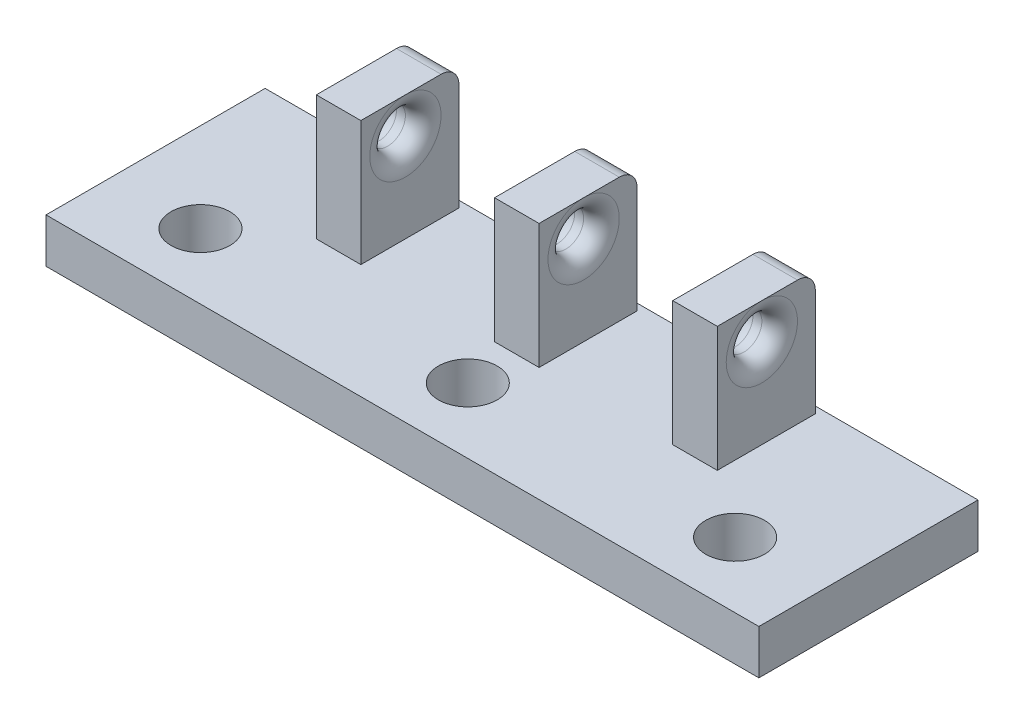
ISO-10303-21;
HEADER;
FILE_DESCRIPTION(('STEP AP214'),'2;1');
FILE_NAME('part.step','',(''),(''),'','','');
FILE_SCHEMA(('AUTOMOTIVE_DESIGN { 1 0 10303 214 1 1 1 1 }'));
ENDSEC;
DATA;
#1=APPLICATION_CONTEXT('core data for automotive mechanical design processes');
#2=APPLICATION_PROTOCOL_DEFINITION('international standard','automotive_design',2000,#1);
#3=PRODUCT_CONTEXT('',#1,'mechanical');
#4=PRODUCT('Part','Part','',(#3));
#5=PRODUCT_RELATED_PRODUCT_CATEGORY('part','',(#4));
#6=PRODUCT_DEFINITION_FORMATION('','',#4);
#7=PRODUCT_DEFINITION_CONTEXT('part definition',#1,'design');
#8=PRODUCT_DEFINITION('design','',#6,#7);
#9=PRODUCT_DEFINITION_SHAPE('','',#8);
#10=(LENGTH_UNIT() NAMED_UNIT(*) SI_UNIT(.MILLI.,.METRE.));
#11=(NAMED_UNIT(*) PLANE_ANGLE_UNIT() SI_UNIT($,.RADIAN.));
#12=(NAMED_UNIT(*) SI_UNIT($,.STERADIAN.) SOLID_ANGLE_UNIT());
#13=UNCERTAINTY_MEASURE_WITH_UNIT(LENGTH_MEASURE(1.E-05),#10,'distance_accuracy_value','');
#14=(GEOMETRIC_REPRESENTATION_CONTEXT(3) GLOBAL_UNCERTAINTY_ASSIGNED_CONTEXT((#13)) GLOBAL_UNIT_ASSIGNED_CONTEXT((#10,
#11,#12)) REPRESENTATION_CONTEXT('',''));
#15=CARTESIAN_POINT('',(0.,0.,0.));
#16=DIRECTION('',(0.,0.,1.));
#17=DIRECTION('',(1.,0.,0.));
#18=AXIS2_PLACEMENT_3D('',#15,#16,#17);
#19=CARTESIAN_POINT('',(0.,2.5,0.));
#20=DIRECTION('',(0.,1.,0.));
#21=DIRECTION('',(0.,0.,1.));
#22=AXIS2_PLACEMENT_3D('',#19,#20,#21);
#23=PLANE('',#22);
#24=DIRECTION('',(1.,0.,0.));
#25=VECTOR('',#24,1.);
#26=CARTESIAN_POINT('',(-20.,2.5,2.37214905674166));
#27=LINE('',#26,#25);
#28=CARTESIAN_POINT('',(-20.,2.5,2.37214905674166));
#29=VERTEX_POINT('',#28);
#30=CARTESIAN_POINT('',(20.,2.5,2.37214905674166));
#31=VERTEX_POINT('',#30);
#32=EDGE_CURVE('E59',#29,#31,#27,.T.);
#33=ORIENTED_EDGE('',*,*,#32,.F.);
#34=DIRECTION('',(0.,0.,1.));
#35=VECTOR('',#34,1.);
#36=CARTESIAN_POINT('',(-20.,2.5,14.6666666666667));
#37=LINE('',#36,#35);
#38=CARTESIAN_POINT('',(-20.,2.5,14.6666666666667));
#39=VERTEX_POINT('',#38);
#40=EDGE_CURVE('E208',#29,#39,#37,.T.);
#41=ORIENTED_EDGE('',*,*,#40,.T.);
#42=DIRECTION('',(1.,0.,0.));
#43=VECTOR('',#42,1.);
#44=CARTESIAN_POINT('',(20.,2.5,14.6666666666667));
#45=LINE('',#44,#43);
#46=CARTESIAN_POINT('',(20.,2.5,14.6666666666667));
#47=VERTEX_POINT('',#46);
#48=EDGE_CURVE('E322',#39,#47,#45,.T.);
#49=ORIENTED_EDGE('',*,*,#48,.T.);
#50=DIRECTION('',(0.,0.,-1.));
#51=VECTOR('',#50,1.);
#52=CARTESIAN_POINT('',(20.,2.5,14.6666666666667));
#53=LINE('',#52,#51);
#54=EDGE_CURVE('E226',#47,#31,#53,.T.);
#55=ORIENTED_EDGE('',*,*,#54,.T.);
#56=EDGE_LOOP('',(#33,#41,#49,#55));
#57=FACE_BOUND('',#56,.T.);
#58=CARTESIAN_POINT('',(1.14491749414469E-13,2.5,11.));
#59=DIRECTION('',(0.,1.,0.));
#60=DIRECTION('',(0.,0.,1.));
#61=AXIS2_PLACEMENT_3D('',#58,#59,#60);
#62=CIRCLE('',#61,1.65);
#63=CARTESIAN_POINT('',(1.14491749414469E-13,2.5,12.65));
#64=VERTEX_POINT('',#63);
#65=EDGE_CURVE('E216',#64,#64,#62,.T.);
#66=ORIENTED_EDGE('',*,*,#65,.F.);
#67=EDGE_LOOP('',(#66));
#68=FACE_BOUND('',#67,.T.);
#69=CARTESIAN_POINT('',(15.0000000000001,2.5,11.));
#70=DIRECTION('',(0.,1.,0.));
#71=DIRECTION('',(0.,0.,1.));
#72=AXIS2_PLACEMENT_3D('',#69,#70,#71);
#73=CIRCLE('',#72,1.65);
#74=CARTESIAN_POINT('',(15.0000000000001,2.5,12.65));
#75=VERTEX_POINT('',#74);
#76=EDGE_CURVE('E330',#75,#75,#73,.T.);
#77=ORIENTED_EDGE('',*,*,#76,.F.);
#78=EDGE_LOOP('',(#77));
#79=FACE_BOUND('',#78,.T.);
#80=CARTESIAN_POINT('',(-14.9999999999999,2.5,11.));
#81=DIRECTION('',(0.,1.,0.));
#82=DIRECTION('',(0.,0.,1.));
#83=AXIS2_PLACEMENT_3D('',#80,#81,#82);
#84=CIRCLE('',#83,1.65);
#85=CARTESIAN_POINT('',(-14.9999999999999,2.5,12.65));
#86=VERTEX_POINT('',#85);
#87=EDGE_CURVE('E336',#86,#86,#84,.T.);
#88=ORIENTED_EDGE('',*,*,#87,.F.);
#89=EDGE_LOOP('',(#88));
#90=FACE_BOUND('',#89,.T.);
#91=DIRECTION('',(-1.,0.,0.));
#92=VECTOR('',#91,1.);
#93=CARTESIAN_POINT('',(-1.25,2.5,2.75));
#94=LINE('',#93,#92);
#95=CARTESIAN_POINT('',(1.25,2.5,2.75));
#96=VERTEX_POINT('',#95);
#97=CARTESIAN_POINT('',(-1.25,2.5,2.75));
#98=VERTEX_POINT('',#97);
#99=EDGE_CURVE('E369',#96,#98,#94,.T.);
#100=ORIENTED_EDGE('',*,*,#99,.F.);
#101=DIRECTION('',(0.,0.,-1.));
#102=VECTOR('',#101,1.);
#103=CARTESIAN_POINT('',(1.25,2.5,8.25));
#104=LINE('',#103,#102);
#105=CARTESIAN_POINT('',(1.25,2.5,8.25));
#106=VERTEX_POINT('',#105);
#107=EDGE_CURVE('E373',#106,#96,#104,.T.);
#108=ORIENTED_EDGE('',*,*,#107,.F.);
#109=DIRECTION('',(1.,0.,0.));
#110=VECTOR('',#109,1.);
#111=CARTESIAN_POINT('',(-1.25,2.5,8.25));
#112=LINE('',#111,#110);
#113=CARTESIAN_POINT('',(-1.25,2.5,8.25));
#114=VERTEX_POINT('',#113);
#115=EDGE_CURVE('E361',#114,#106,#112,.T.);
#116=ORIENTED_EDGE('',*,*,#115,.F.);
#117=DIRECTION('',(0.,0.,1.));
#118=VECTOR('',#117,1.);
#119=CARTESIAN_POINT('',(-1.25,2.5,8.25));
#120=LINE('',#119,#118);
#121=EDGE_CURVE('E365',#98,#114,#120,.T.);
#122=ORIENTED_EDGE('',*,*,#121,.F.);
#123=EDGE_LOOP('',(#100,#108,#116,#122));
#124=FACE_BOUND('',#123,.T.);
#125=DIRECTION('',(-1.,0.,0.));
#126=VECTOR('',#125,1.);
#127=CARTESIAN_POINT('',(8.75,2.5,2.75));
#128=LINE('',#127,#126);
#129=CARTESIAN_POINT('',(11.25,2.5,2.75));
#130=VERTEX_POINT('',#129);
#131=CARTESIAN_POINT('',(8.75,2.5,2.75));
#132=VERTEX_POINT('',#131);
#133=EDGE_CURVE('E405',#130,#132,#128,.T.);
#134=ORIENTED_EDGE('',*,*,#133,.F.);
#135=DIRECTION('',(0.,0.,-1.));
#136=VECTOR('',#135,1.);
#137=CARTESIAN_POINT('',(11.25,2.5,8.25));
#138=LINE('',#137,#136);
#139=CARTESIAN_POINT('',(11.25,2.5,8.25));
#140=VERTEX_POINT('',#139);
#141=EDGE_CURVE('E377',#140,#130,#138,.T.);
#142=ORIENTED_EDGE('',*,*,#141,.F.);
#143=DIRECTION('',(1.,0.,0.));
#144=VECTOR('',#143,1.);
#145=CARTESIAN_POINT('',(8.75,2.5,8.25));
#146=LINE('',#145,#144);
#147=CARTESIAN_POINT('',(8.75,2.5,8.25));
#148=VERTEX_POINT('',#147);
#149=EDGE_CURVE('E392',#148,#140,#146,.T.);
#150=ORIENTED_EDGE('',*,*,#149,.F.);
#151=DIRECTION('',(0.,0.,1.));
#152=VECTOR('',#151,1.);
#153=CARTESIAN_POINT('',(8.75,2.5,8.25));
#154=LINE('',#153,#152);
#155=EDGE_CURVE('E409',#132,#148,#154,.T.);
#156=ORIENTED_EDGE('',*,*,#155,.F.);
#157=EDGE_LOOP('',(#134,#142,#150,#156));
#158=FACE_BOUND('',#157,.T.);
#159=DIRECTION('',(-1.,0.,0.));
#160=VECTOR('',#159,1.);
#161=CARTESIAN_POINT('',(-8.75,2.5,2.75));
#162=LINE('',#161,#160);
#163=CARTESIAN_POINT('',(-8.75,2.5,2.75));
#164=VERTEX_POINT('',#163);
#165=CARTESIAN_POINT('',(-11.25,2.5,2.75));
#166=VERTEX_POINT('',#165);
#167=EDGE_CURVE('E445',#164,#166,#162,.T.);
#168=ORIENTED_EDGE('',*,*,#167,.F.);
#169=DIRECTION('',(0.,0.,-1.));
#170=VECTOR('',#169,1.);
#171=CARTESIAN_POINT('',(-8.75,2.5,8.25));
#172=LINE('',#171,#170);
#173=CARTESIAN_POINT('',(-8.75,2.5,8.25));
#174=VERTEX_POINT('',#173);
#175=EDGE_CURVE('E427',#174,#164,#172,.T.);
#176=ORIENTED_EDGE('',*,*,#175,.F.);
#177=DIRECTION('',(1.,0.,0.));
#178=VECTOR('',#177,1.);
#179=CARTESIAN_POINT('',(-8.75,2.5,8.25));
#180=LINE('',#179,#178);
#181=CARTESIAN_POINT('',(-11.25,2.5,8.25));
#182=VERTEX_POINT('',#181);
#183=EDGE_CURVE('E432',#182,#174,#180,.T.);
#184=ORIENTED_EDGE('',*,*,#183,.F.);
#185=DIRECTION('',(0.,0.,1.));
#186=VECTOR('',#185,1.);
#187=CARTESIAN_POINT('',(-11.25,2.5,8.25));
#188=LINE('',#187,#186);
#189=EDGE_CURVE('E449',#166,#182,#188,.T.);
#190=ORIENTED_EDGE('',*,*,#189,.F.);
#191=EDGE_LOOP('',(#168,#176,#184,#190));
#192=FACE_BOUND('',#191,.T.);
#193=ADVANCED_FACE('F43',(#57,#68,#79,#90,#124,#158,#192),#23,.T.);
#194=CARTESIAN_POINT('',(0.,0.,0.));
#195=DIRECTION('',(0.,1.,0.));
#196=DIRECTION('',(0.,0.,1.));
#197=AXIS2_PLACEMENT_3D('',#194,#195,#196);
#198=PLANE('',#197);
#199=DIRECTION('',(0.,0.,1.));
#200=VECTOR('',#199,1.);
#201=CARTESIAN_POINT('',(-20.,0.,14.6666666666667));
#202=LINE('',#201,#200);
#203=CARTESIAN_POINT('',(-20.,0.,2.37214905674166));
#204=VERTEX_POINT('',#203);
#205=CARTESIAN_POINT('',(-20.,0.,14.6666666666667));
#206=VERTEX_POINT('',#205);
#207=EDGE_CURVE('E206',#204,#206,#202,.T.);
#208=ORIENTED_EDGE('',*,*,#207,.F.);
#209=DIRECTION('',(-1.,0.,0.));
#210=VECTOR('',#209,1.);
#211=CARTESIAN_POINT('',(-20.,0.,2.37214905674166));
#212=LINE('',#211,#210);
#213=CARTESIAN_POINT('',(20.,0.,2.37214905674166));
#214=VERTEX_POINT('',#213);
#215=EDGE_CURVE('E190',#214,#204,#212,.T.);
#216=ORIENTED_EDGE('',*,*,#215,.F.);
#217=DIRECTION('',(0.,0.,-1.));
#218=VECTOR('',#217,1.);
#219=CARTESIAN_POINT('',(20.,0.,14.6666666666667));
#220=LINE('',#219,#218);
#221=CARTESIAN_POINT('',(20.,0.,14.6666666666667));
#222=VERTEX_POINT('',#221);
#223=EDGE_CURVE('E220',#222,#214,#220,.T.);
#224=ORIENTED_EDGE('',*,*,#223,.F.);
#225=DIRECTION('',(1.,0.,0.));
#226=VECTOR('',#225,1.);
#227=CARTESIAN_POINT('',(20.,0.,14.6666666666667));
#228=LINE('',#227,#226);
#229=EDGE_CURVE('E213',#206,#222,#228,.T.);
#230=ORIENTED_EDGE('',*,*,#229,.F.);
#231=EDGE_LOOP('',(#208,#216,#224,#230));
#232=FACE_BOUND('',#231,.T.);
#233=CARTESIAN_POINT('',(1.14491749414469E-13,0.,11.));
#234=DIRECTION('',(0.,1.,0.));
#235=DIRECTION('',(0.,0.,1.));
#236=AXIS2_PLACEMENT_3D('',#233,#234,#235);
#237=CIRCLE('',#236,1.65);
#238=CARTESIAN_POINT('',(1.14491749414469E-13,0.,12.65));
#239=VERTEX_POINT('',#238);
#240=EDGE_CURVE('E223',#239,#239,#237,.T.);
#241=ORIENTED_EDGE('',*,*,#240,.T.);
#242=EDGE_LOOP('',(#241));
#243=FACE_BOUND('',#242,.T.);
#244=CARTESIAN_POINT('',(15.0000000000001,0.,11.));
#245=DIRECTION('',(0.,1.,0.));
#246=DIRECTION('',(0.,0.,1.));
#247=AXIS2_PLACEMENT_3D('',#244,#245,#246);
#248=CIRCLE('',#247,1.65);
#249=CARTESIAN_POINT('',(15.0000000000001,0.,12.65));
#250=VERTEX_POINT('',#249);
#251=EDGE_CURVE('E332',#250,#250,#248,.T.);
#252=ORIENTED_EDGE('',*,*,#251,.T.);
#253=EDGE_LOOP('',(#252));
#254=FACE_BOUND('',#253,.T.);
#255=CARTESIAN_POINT('',(-14.9999999999999,0.,11.));
#256=DIRECTION('',(0.,1.,0.));
#257=DIRECTION('',(0.,0.,1.));
#258=AXIS2_PLACEMENT_3D('',#255,#256,#257);
#259=CIRCLE('',#258,1.65);
#260=CARTESIAN_POINT('',(-14.9999999999999,0.,12.65));
#261=VERTEX_POINT('',#260);
#262=EDGE_CURVE('E340',#261,#261,#259,.T.);
#263=ORIENTED_EDGE('',*,*,#262,.T.);
#264=EDGE_LOOP('',(#263));
#265=FACE_BOUND('',#264,.T.);
#266=ADVANCED_FACE('F211',(#232,#243,#254,#265),#198,.F.);
#267=CARTESIAN_POINT('',(-20.,2.5,14.6666666666667));
#268=DIRECTION('',(1.,0.,0.));
#269=DIRECTION('',(0.,0.,-1.));
#270=AXIS2_PLACEMENT_3D('',#267,#268,#269);
#271=PLANE('',#270);
#272=ORIENTED_EDGE('',*,*,#40,.F.);
#273=DIRECTION('',(0.,1.,0.));
#274=VECTOR('',#273,1.);
#275=CARTESIAN_POINT('',(-20.,-0.00100000000000013,2.37214905674166));
#276=LINE('',#275,#274);
#277=EDGE_CURVE('E193',#204,#29,#276,.T.);
#278=ORIENTED_EDGE('',*,*,#277,.F.);
#279=ORIENTED_EDGE('',*,*,#207,.T.);
#280=DIRECTION('',(0.,-1.,0.));
#281=VECTOR('',#280,1.);
#282=CARTESIAN_POINT('',(-20.,2.5,14.6666666666667));
#283=LINE('',#282,#281);
#284=EDGE_CURVE('E235',#39,#206,#283,.T.);
#285=ORIENTED_EDGE('',*,*,#284,.F.);
#286=EDGE_LOOP('',(#272,#278,#279,#285));
#287=FACE_BOUND('',#286,.T.);
#288=ADVANCED_FACE('F204',(#287),#271,.F.);
#289=CARTESIAN_POINT('',(20.,2.5,14.6666666666667));
#290=DIRECTION('',(0.,0.,-1.));
#291=DIRECTION('',(-1.,0.,0.));
#292=AXIS2_PLACEMENT_3D('',#289,#290,#291);
#293=PLANE('',#292);
#294=ORIENTED_EDGE('',*,*,#229,.T.);
#295=DIRECTION('',(0.,-1.,0.));
#296=VECTOR('',#295,1.);
#297=CARTESIAN_POINT('',(20.,2.5,14.6666666666667));
#298=LINE('',#297,#296);
#299=EDGE_CURVE('E231',#47,#222,#298,.T.);
#300=ORIENTED_EDGE('',*,*,#299,.F.);
#301=ORIENTED_EDGE('',*,*,#48,.F.);
#302=ORIENTED_EDGE('',*,*,#284,.T.);
#303=EDGE_LOOP('',(#294,#300,#301,#302));
#304=FACE_BOUND('',#303,.T.);
#305=ADVANCED_FACE('F663',(#304),#293,.F.);
#306=CARTESIAN_POINT('',(20.,2.5,14.6666666666667));
#307=DIRECTION('',(-1.,0.,0.));
#308=DIRECTION('',(0.,0.,1.));
#309=AXIS2_PLACEMENT_3D('',#306,#307,#308);
#310=PLANE('',#309);
#311=ORIENTED_EDGE('',*,*,#223,.T.);
#312=DIRECTION('',(0.,1.,0.));
#313=VECTOR('',#312,1.);
#314=CARTESIAN_POINT('',(20.,-0.00100000000000013,2.37214905674166));
#315=LINE('',#314,#313);
#316=EDGE_CURVE('E194',#214,#31,#315,.T.);
#317=ORIENTED_EDGE('',*,*,#316,.T.);
#318=ORIENTED_EDGE('',*,*,#54,.F.);
#319=ORIENTED_EDGE('',*,*,#299,.T.);
#320=EDGE_LOOP('',(#311,#317,#318,#319));
#321=FACE_BOUND('',#320,.T.);
#322=ADVANCED_FACE('F657',(#321),#310,.F.);
#323=CARTESIAN_POINT('',(1.14491749414469E-13,2.5,11.));
#324=DIRECTION('',(0.,-1.,0.));
#325=DIRECTION('',(0.,0.,-1.));
#326=AXIS2_PLACEMENT_3D('',#323,#324,#325);
#327=CYLINDRICAL_SURFACE('',#326,1.65);
#328=ORIENTED_EDGE('',*,*,#65,.T.);
#329=EDGE_LOOP('',(#328));
#330=FACE_BOUND('',#329,.T.);
#331=ORIENTED_EDGE('',*,*,#240,.F.);
#332=EDGE_LOOP('',(#331));
#333=FACE_BOUND('',#332,.T.);
#334=ADVANCED_FACE('F654',(#330,#333),#327,.F.);
#335=CARTESIAN_POINT('',(15.0000000000001,2.5,11.));
#336=DIRECTION('',(0.,-1.,0.));
#337=DIRECTION('',(0.,0.,-1.));
#338=AXIS2_PLACEMENT_3D('',#335,#336,#337);
#339=CYLINDRICAL_SURFACE('',#338,1.65);
#340=ORIENTED_EDGE('',*,*,#76,.T.);
#341=EDGE_LOOP('',(#340));
#342=FACE_BOUND('',#341,.T.);
#343=ORIENTED_EDGE('',*,*,#251,.F.);
#344=EDGE_LOOP('',(#343));
#345=FACE_BOUND('',#344,.T.);
#346=ADVANCED_FACE('F650',(#342,#345),#339,.F.);
#347=CARTESIAN_POINT('',(-14.9999999999999,2.5,11.));
#348=DIRECTION('',(0.,-1.,0.));
#349=DIRECTION('',(0.,0.,-1.));
#350=AXIS2_PLACEMENT_3D('',#347,#348,#349);
#351=CYLINDRICAL_SURFACE('',#350,1.65);
#352=ORIENTED_EDGE('',*,*,#87,.T.);
#353=EDGE_LOOP('',(#352));
#354=FACE_BOUND('',#353,.T.);
#355=ORIENTED_EDGE('',*,*,#262,.F.);
#356=EDGE_LOOP('',(#355));
#357=FACE_BOUND('',#356,.T.);
#358=ADVANCED_FACE('F647',(#354,#357),#351,.F.);
#359=CARTESIAN_POINT('',(1.25,9.5,8.25));
#360=DIRECTION('',(-1.,0.,0.));
#361=DIRECTION('',(0.,0.,1.));
#362=AXIS2_PLACEMENT_3D('',#359,#360,#361);
#363=PLANE('',#362);
#364=DIRECTION('',(0.,-1.,0.));
#365=VECTOR('',#364,1.);
#366=CARTESIAN_POINT('',(1.25,9.5,2.75));
#367=LINE('',#366,#365);
#368=CARTESIAN_POINT('',(1.25,8.5,2.75));
#369=VERTEX_POINT('',#368);
#370=EDGE_CURVE('E344',#369,#96,#367,.T.);
#371=ORIENTED_EDGE('',*,*,#370,.F.);
#372=CARTESIAN_POINT('',(1.25,8.5,3.75));
#373=DIRECTION('',(-1.,0.,0.));
#374=DIRECTION('',(0.,0.,1.));
#375=AXIS2_PLACEMENT_3D('',#372,#373,#374);
#376=CIRCLE('',#375,1.);
#377=CARTESIAN_POINT('',(1.25,9.5,3.75));
#378=VERTEX_POINT('',#377);
#379=EDGE_CURVE('E296',#369,#378,#376,.F.);
#380=ORIENTED_EDGE('',*,*,#379,.T.);
#381=DIRECTION('',(0.,0.,-1.));
#382=VECTOR('',#381,1.);
#383=CARTESIAN_POINT('',(1.25,9.5,8.25));
#384=LINE('',#383,#382);
#385=CARTESIAN_POINT('',(1.25,9.5,5.75000000000001));
#386=VERTEX_POINT('',#385);
#387=EDGE_CURVE('E364',#386,#378,#384,.T.);
#388=ORIENTED_EDGE('',*,*,#387,.F.);
#389=CARTESIAN_POINT('',(1.25,7.5,5.75000000000001));
#390=DIRECTION('',(-1.,0.,0.));
#391=DIRECTION('',(0.,0.,1.));
#392=AXIS2_PLACEMENT_3D('',#389,#390,#391);
#393=CIRCLE('',#392,2.);
#394=EDGE_CURVE('E254',#386,#386,#393,.T.);
#395=ORIENTED_EDGE('',*,*,#394,.T.);
#396=CARTESIAN_POINT('',(1.25,9.5,8.25));
#397=VERTEX_POINT('',#396);
#398=EDGE_CURVE('E384',#397,#386,#384,.T.);
#399=ORIENTED_EDGE('',*,*,#398,.F.);
#400=DIRECTION('',(0.,-1.,0.));
#401=VECTOR('',#400,1.);
#402=CARTESIAN_POINT('',(1.25,9.5,8.25));
#403=LINE('',#402,#401);
#404=EDGE_CURVE('E356',#397,#106,#403,.T.);
#405=ORIENTED_EDGE('',*,*,#404,.T.);
#406=ORIENTED_EDGE('',*,*,#107,.T.);
#407=EDGE_LOOP('',(#371,#380,#388,#395,#399,#405,#406));
#408=FACE_BOUND('',#407,.T.);
#409=ADVANCED_FACE('F496',(#408),#363,.F.);
#410=CARTESIAN_POINT('',(-1.25,9.5,2.75));
#411=DIRECTION('',(0.,0.,1.));
#412=DIRECTION('',(1.,0.,0.));
#413=AXIS2_PLACEMENT_3D('',#410,#411,#412);
#414=PLANE('',#413);
#415=DIRECTION('',(0.,-1.,0.));
#416=VECTOR('',#415,1.);
#417=CARTESIAN_POINT('',(-1.25,9.5,2.75));
#418=LINE('',#417,#416);
#419=CARTESIAN_POINT('',(-1.25,8.5,2.75));
#420=VERTEX_POINT('',#419);
#421=EDGE_CURVE('E350',#420,#98,#418,.T.);
#422=ORIENTED_EDGE('',*,*,#421,.F.);
#423=DIRECTION('',(-1.,0.,0.));
#424=VECTOR('',#423,1.);
#425=CARTESIAN_POINT('',(-1.25,8.5,2.75));
#426=LINE('',#425,#424);
#427=EDGE_CURVE('E293',#420,#369,#426,.F.);
#428=ORIENTED_EDGE('',*,*,#427,.T.);
#429=ORIENTED_EDGE('',*,*,#370,.T.);
#430=ORIENTED_EDGE('',*,*,#99,.T.);
#431=EDGE_LOOP('',(#422,#428,#429,#430));
#432=FACE_BOUND('',#431,.T.);
#433=ADVANCED_FACE('F505',(#432),#414,.F.);
#434=CARTESIAN_POINT('',(-1.25,9.5,8.25));
#435=DIRECTION('',(1.,0.,0.));
#436=DIRECTION('',(0.,0.,-1.));
#437=AXIS2_PLACEMENT_3D('',#434,#435,#436);
#438=PLANE('',#437);
#439=DIRECTION('',(0.,0.,1.));
#440=VECTOR('',#439,1.);
#441=CARTESIAN_POINT('',(-1.25,9.5,8.25));
#442=LINE('',#441,#440);
#443=CARTESIAN_POINT('',(-1.25,9.5,3.75));
#444=VERTEX_POINT('',#443);
#445=CARTESIAN_POINT('',(-1.25,9.5,5.75000000000001));
#446=VERTEX_POINT('',#445);
#447=EDGE_CURVE('E380',#444,#446,#442,.T.);
#448=ORIENTED_EDGE('',*,*,#447,.F.);
#449=CARTESIAN_POINT('',(-1.25,8.5,3.75));
#450=DIRECTION('',(1.,0.,0.));
#451=DIRECTION('',(0.,0.,-1.));
#452=AXIS2_PLACEMENT_3D('',#449,#450,#451);
#453=CIRCLE('',#452,1.);
#454=EDGE_CURVE('E290',#444,#420,#453,.F.);
#455=ORIENTED_EDGE('',*,*,#454,.T.);
#456=ORIENTED_EDGE('',*,*,#421,.T.);
#457=ORIENTED_EDGE('',*,*,#121,.T.);
#458=DIRECTION('',(0.,-1.,0.));
#459=VECTOR('',#458,1.);
#460=CARTESIAN_POINT('',(-1.25,9.5,8.25));
#461=LINE('',#460,#459);
#462=CARTESIAN_POINT('',(-1.25,9.5,8.25));
#463=VERTEX_POINT('',#462);
#464=EDGE_CURVE('E353',#463,#114,#461,.T.);
#465=ORIENTED_EDGE('',*,*,#464,.F.);
#466=EDGE_CURVE('E383',#446,#463,#442,.T.);
#467=ORIENTED_EDGE('',*,*,#466,.F.);
#468=CARTESIAN_POINT('',(-1.25,7.5,5.75000000000001));
#469=DIRECTION('',(1.,0.,0.));
#470=DIRECTION('',(0.,0.,-1.));
#471=AXIS2_PLACEMENT_3D('',#468,#469,#470);
#472=CIRCLE('',#471,2.);
#473=EDGE_CURVE('E266',#446,#446,#472,.T.);
#474=ORIENTED_EDGE('',*,*,#473,.T.);
#475=EDGE_LOOP('',(#448,#455,#456,#457,#465,#467,#474));
#476=FACE_BOUND('',#475,.T.);
#477=ADVANCED_FACE('F487',(#476),#438,.F.);
#478=CARTESIAN_POINT('',(-1.25,9.5,8.25));
#479=DIRECTION('',(0.,0.,-1.));
#480=DIRECTION('',(-1.,0.,0.));
#481=AXIS2_PLACEMENT_3D('',#478,#479,#480);
#482=PLANE('',#481);
#483=ORIENTED_EDGE('',*,*,#115,.T.);
#484=ORIENTED_EDGE('',*,*,#404,.F.);
#485=DIRECTION('',(1.,0.,0.));
#486=VECTOR('',#485,1.);
#487=CARTESIAN_POINT('',(-1.25,9.5,8.25));
#488=LINE('',#487,#486);
#489=EDGE_CURVE('E360',#463,#397,#488,.T.);
#490=ORIENTED_EDGE('',*,*,#489,.F.);
#491=ORIENTED_EDGE('',*,*,#464,.T.);
#492=EDGE_LOOP('',(#483,#484,#490,#491));
#493=FACE_BOUND('',#492,.T.);
#494=ADVANCED_FACE('F491',(#493),#482,.F.);
#495=CARTESIAN_POINT('',(0.,9.5,0.));
#496=DIRECTION('',(0.,-1.,0.));
#497=DIRECTION('',(0.,0.,-1.));
#498=AXIS2_PLACEMENT_3D('',#495,#496,#497);
#499=PLANE('',#498);
#500=ORIENTED_EDGE('',*,*,#387,.T.);
#501=DIRECTION('',(-1.,0.,0.));
#502=VECTOR('',#501,1.);
#503=CARTESIAN_POINT('',(0.,9.5,3.75));
#504=LINE('',#503,#502);
#505=EDGE_CURVE('E286',#378,#444,#504,.T.);
#506=ORIENTED_EDGE('',*,*,#505,.T.);
#507=ORIENTED_EDGE('',*,*,#447,.T.);
#508=ORIENTED_EDGE('',*,*,#466,.T.);
#509=ORIENTED_EDGE('',*,*,#489,.T.);
#510=ORIENTED_EDGE('',*,*,#398,.T.);
#511=EDGE_LOOP('',(#500,#506,#507,#508,#509,#510));
#512=FACE_BOUND('',#511,.T.);
#513=ADVANCED_FACE('F481',(#512),#499,.F.);
#514=CARTESIAN_POINT('',(11.25,9.5,8.25));
#515=DIRECTION('',(-1.,0.,0.));
#516=DIRECTION('',(0.,0.,1.));
#517=AXIS2_PLACEMENT_3D('',#514,#515,#516);
#518=PLANE('',#517);
#519=DIRECTION('',(0.,-1.,0.));
#520=VECTOR('',#519,1.);
#521=CARTESIAN_POINT('',(11.25,9.5,2.75));
#522=LINE('',#521,#520);
#523=CARTESIAN_POINT('',(11.25,8.5,2.75));
#524=VERTEX_POINT('',#523);
#525=EDGE_CURVE('E424',#524,#130,#522,.T.);
#526=ORIENTED_EDGE('',*,*,#525,.F.);
#527=CARTESIAN_POINT('',(11.25,8.5,3.75));
#528=DIRECTION('',(-1.,0.,0.));
#529=DIRECTION('',(0.,0.,1.));
#530=AXIS2_PLACEMENT_3D('',#527,#528,#529);
#531=CIRCLE('',#530,1.);
#532=CARTESIAN_POINT('',(11.25,9.5,3.75));
#533=VERTEX_POINT('',#532);
#534=EDGE_CURVE('E11',#524,#533,#531,.F.);
#535=ORIENTED_EDGE('',*,*,#534,.T.);
#536=DIRECTION('',(0.,0.,-1.));
#537=VECTOR('',#536,1.);
#538=CARTESIAN_POINT('',(11.25,9.5,8.25));
#539=LINE('',#538,#537);
#540=CARTESIAN_POINT('',(11.25,9.5,5.75));
#541=VERTEX_POINT('',#540);
#542=EDGE_CURVE('E393',#541,#533,#539,.T.);
#543=ORIENTED_EDGE('',*,*,#542,.F.);
#544=CARTESIAN_POINT('',(11.25,7.5,5.75));
#545=DIRECTION('',(-1.,0.,0.));
#546=DIRECTION('',(0.,0.,1.));
#547=AXIS2_PLACEMENT_3D('',#544,#545,#546);
#548=CIRCLE('',#547,2.);
#549=EDGE_CURVE('E282',#541,#541,#548,.T.);
#550=ORIENTED_EDGE('',*,*,#549,.T.);
#551=CARTESIAN_POINT('',(11.25,9.5,8.25));
#552=VERTEX_POINT('',#551);
#553=EDGE_CURVE('E388',#552,#541,#539,.T.);
#554=ORIENTED_EDGE('',*,*,#553,.F.);
#555=DIRECTION('',(0.,-1.,0.));
#556=VECTOR('',#555,1.);
#557=CARTESIAN_POINT('',(11.25,9.5,8.25));
#558=LINE('',#557,#556);
#559=EDGE_CURVE('E401',#552,#140,#558,.T.);
#560=ORIENTED_EDGE('',*,*,#559,.T.);
#561=ORIENTED_EDGE('',*,*,#141,.T.);
#562=EDGE_LOOP('',(#526,#535,#543,#550,#554,#560,#561));
#563=FACE_BOUND('',#562,.T.);
#564=ADVANCED_FACE('F595',(#563),#518,.F.);
#565=CARTESIAN_POINT('',(8.75,9.5,2.75));
#566=DIRECTION('',(0.,0.,1.));
#567=DIRECTION('',(1.,0.,0.));
#568=AXIS2_PLACEMENT_3D('',#565,#566,#567);
#569=PLANE('',#568);
#570=DIRECTION('',(0.,-1.,0.));
#571=VECTOR('',#570,1.);
#572=CARTESIAN_POINT('',(8.75,9.5,2.75));
#573=LINE('',#572,#571);
#574=CARTESIAN_POINT('',(8.75,8.5,2.75));
#575=VERTEX_POINT('',#574);
#576=EDGE_CURVE('E421',#575,#132,#573,.T.);
#577=ORIENTED_EDGE('',*,*,#576,.F.);
#578=DIRECTION('',(-1.,0.,0.));
#579=VECTOR('',#578,1.);
#580=CARTESIAN_POINT('',(8.75,8.5,2.75));
#581=LINE('',#580,#579);
#582=EDGE_CURVE('E52',#575,#524,#581,.F.);
#583=ORIENTED_EDGE('',*,*,#582,.T.);
#584=ORIENTED_EDGE('',*,*,#525,.T.);
#585=ORIENTED_EDGE('',*,*,#133,.T.);
#586=EDGE_LOOP('',(#577,#583,#584,#585));
#587=FACE_BOUND('',#586,.T.);
#588=ADVANCED_FACE('F624',(#587),#569,.F.);
#589=CARTESIAN_POINT('',(8.75,9.5,8.25));
#590=DIRECTION('',(1.,0.,0.));
#591=DIRECTION('',(0.,0.,-1.));
#592=AXIS2_PLACEMENT_3D('',#589,#590,#591);
#593=PLANE('',#592);
#594=DIRECTION('',(0.,0.,1.));
#595=VECTOR('',#594,1.);
#596=CARTESIAN_POINT('',(8.75,9.5,8.25));
#597=LINE('',#596,#595);
#598=CARTESIAN_POINT('',(8.75,9.5,3.75));
#599=VERTEX_POINT('',#598);
#600=CARTESIAN_POINT('',(8.75,9.5,5.75));
#601=VERTEX_POINT('',#600);
#602=EDGE_CURVE('E394',#599,#601,#597,.T.);
#603=ORIENTED_EDGE('',*,*,#602,.F.);
#604=CARTESIAN_POINT('',(8.75,8.5,3.75));
#605=DIRECTION('',(1.,0.,0.));
#606=DIRECTION('',(0.,0.,-1.));
#607=AXIS2_PLACEMENT_3D('',#604,#605,#606);
#608=CIRCLE('',#607,1.);
#609=EDGE_CURVE('E316',#599,#575,#608,.F.);
#610=ORIENTED_EDGE('',*,*,#609,.T.);
#611=ORIENTED_EDGE('',*,*,#576,.T.);
#612=ORIENTED_EDGE('',*,*,#155,.T.);
#613=DIRECTION('',(0.,-1.,0.));
#614=VECTOR('',#613,1.);
#615=CARTESIAN_POINT('',(8.75,9.5,8.25));
#616=LINE('',#615,#614);
#617=CARTESIAN_POINT('',(8.75,9.5,8.25));
#618=VERTEX_POINT('',#617);
#619=EDGE_CURVE('E418',#618,#148,#616,.T.);
#620=ORIENTED_EDGE('',*,*,#619,.F.);
#621=EDGE_CURVE('E397',#601,#618,#597,.T.);
#622=ORIENTED_EDGE('',*,*,#621,.F.);
#623=CARTESIAN_POINT('',(8.75,7.5,5.75));
#624=DIRECTION('',(1.,0.,0.));
#625=DIRECTION('',(0.,0.,-1.));
#626=AXIS2_PLACEMENT_3D('',#623,#624,#625);
#627=CIRCLE('',#626,2.);
#628=EDGE_CURVE('E270',#601,#601,#627,.T.);
#629=ORIENTED_EDGE('',*,*,#628,.T.);
#630=EDGE_LOOP('',(#603,#610,#611,#612,#620,#622,#629));
#631=FACE_BOUND('',#630,.T.);
#632=ADVANCED_FACE('F627',(#631),#593,.F.);
#633=CARTESIAN_POINT('',(8.75,9.5,8.25));
#634=DIRECTION('',(0.,0.,-1.));
#635=DIRECTION('',(-1.,0.,0.));
#636=AXIS2_PLACEMENT_3D('',#633,#634,#635);
#637=PLANE('',#636);
#638=ORIENTED_EDGE('',*,*,#149,.T.);
#639=ORIENTED_EDGE('',*,*,#559,.F.);
#640=DIRECTION('',(1.,0.,0.));
#641=VECTOR('',#640,1.);
#642=CARTESIAN_POINT('',(8.75,9.5,8.25));
#643=LINE('',#642,#641);
#644=EDGE_CURVE('E398',#618,#552,#643,.T.);
#645=ORIENTED_EDGE('',*,*,#644,.F.);
#646=ORIENTED_EDGE('',*,*,#619,.T.);
#647=EDGE_LOOP('',(#638,#639,#645,#646));
#648=FACE_BOUND('',#647,.T.);
#649=ADVANCED_FACE('F630',(#648),#637,.F.);
#650=CARTESIAN_POINT('',(0.,9.5,0.));
#651=DIRECTION('',(0.,-1.,0.));
#652=DIRECTION('',(0.,0.,-1.));
#653=AXIS2_PLACEMENT_3D('',#650,#651,#652);
#654=PLANE('',#653);
#655=ORIENTED_EDGE('',*,*,#542,.T.);
#656=DIRECTION('',(-1.,0.,0.));
#657=VECTOR('',#656,1.);
#658=CARTESIAN_POINT('',(0.,9.5,3.75));
#659=LINE('',#658,#657);
#660=EDGE_CURVE('E312',#533,#599,#659,.T.);
#661=ORIENTED_EDGE('',*,*,#660,.T.);
#662=ORIENTED_EDGE('',*,*,#602,.T.);
#663=ORIENTED_EDGE('',*,*,#621,.T.);
#664=ORIENTED_EDGE('',*,*,#644,.T.);
#665=ORIENTED_EDGE('',*,*,#553,.T.);
#666=EDGE_LOOP('',(#655,#661,#662,#663,#664,#665));
#667=FACE_BOUND('',#666,.T.);
#668=ADVANCED_FACE('F597',(#667),#654,.F.);
#669=CARTESIAN_POINT('',(-8.75,9.5,8.25));
#670=DIRECTION('',(-1.,0.,0.));
#671=DIRECTION('',(0.,0.,1.));
#672=AXIS2_PLACEMENT_3D('',#669,#670,#671);
#673=PLANE('',#672);
#674=DIRECTION('',(0.,-1.,0.));
#675=VECTOR('',#674,1.);
#676=CARTESIAN_POINT('',(-8.75,9.5,2.75));
#677=LINE('',#676,#675);
#678=CARTESIAN_POINT('',(-8.75,8.5,2.75));
#679=VERTEX_POINT('',#678);
#680=EDGE_CURVE('E200',#679,#164,#677,.T.);
#681=ORIENTED_EDGE('',*,*,#680,.F.);
#682=CARTESIAN_POINT('',(-8.75,8.5,3.75));
#683=DIRECTION('',(-1.,0.,0.));
#684=DIRECTION('',(0.,0.,1.));
#685=AXIS2_PLACEMENT_3D('',#682,#683,#684);
#686=CIRCLE('',#685,1.);
#687=CARTESIAN_POINT('',(-8.75,9.5,3.75));
#688=VERTEX_POINT('',#687);
#689=EDGE_CURVE('E309',#679,#688,#686,.F.);
#690=ORIENTED_EDGE('',*,*,#689,.T.);
#691=DIRECTION('',(0.,0.,-1.));
#692=VECTOR('',#691,1.);
#693=CARTESIAN_POINT('',(-8.75,9.5,8.25));
#694=LINE('',#693,#692);
#695=CARTESIAN_POINT('',(-8.75,9.5,5.75000000000001));
#696=VERTEX_POINT('',#695);
#697=EDGE_CURVE('E433',#696,#688,#694,.T.);
#698=ORIENTED_EDGE('',*,*,#697,.F.);
#699=CARTESIAN_POINT('',(-8.75,7.5,5.75000000000001));
#700=DIRECTION('',(-1.,0.,0.));
#701=DIRECTION('',(0.,0.,1.));
#702=AXIS2_PLACEMENT_3D('',#699,#700,#701);
#703=CIRCLE('',#702,2.);
#704=EDGE_CURVE('E238',#696,#696,#703,.T.);
#705=ORIENTED_EDGE('',*,*,#704,.T.);
#706=CARTESIAN_POINT('',(-8.75,9.5,8.25));
#707=VERTEX_POINT('',#706);
#708=EDGE_CURVE('E428',#707,#696,#694,.T.);
#709=ORIENTED_EDGE('',*,*,#708,.F.);
#710=DIRECTION('',(0.,-1.,0.));
#711=VECTOR('',#710,1.);
#712=CARTESIAN_POINT('',(-8.75,9.5,8.25));
#713=LINE('',#712,#711);
#714=EDGE_CURVE('E441',#707,#174,#713,.T.);
#715=ORIENTED_EDGE('',*,*,#714,.T.);
#716=ORIENTED_EDGE('',*,*,#175,.T.);
#717=EDGE_LOOP('',(#681,#690,#698,#705,#709,#715,#716));
#718=FACE_BOUND('',#717,.T.);
#719=ADVANCED_FACE('F526',(#718),#673,.F.);
#720=CARTESIAN_POINT('',(-8.75,9.5,2.75));
#721=DIRECTION('',(0.,0.,1.));
#722=DIRECTION('',(1.,0.,0.));
#723=AXIS2_PLACEMENT_3D('',#720,#721,#722);
#724=PLANE('',#723);
#725=DIRECTION('',(0.,-1.,0.));
#726=VECTOR('',#725,1.);
#727=CARTESIAN_POINT('',(-11.25,9.5,2.75));
#728=LINE('',#727,#726);
#729=CARTESIAN_POINT('',(-11.25,8.5,2.75));
#730=VERTEX_POINT('',#729);
#731=EDGE_CURVE('E461',#730,#166,#728,.T.);
#732=ORIENTED_EDGE('',*,*,#731,.F.);
#733=DIRECTION('',(-1.,0.,0.));
#734=VECTOR('',#733,1.);
#735=CARTESIAN_POINT('',(-8.75,8.5,2.75));
#736=LINE('',#735,#734);
#737=EDGE_CURVE('E306',#730,#679,#736,.F.);
#738=ORIENTED_EDGE('',*,*,#737,.T.);
#739=ORIENTED_EDGE('',*,*,#680,.T.);
#740=ORIENTED_EDGE('',*,*,#167,.T.);
#741=EDGE_LOOP('',(#732,#738,#739,#740));
#742=FACE_BOUND('',#741,.T.);
#743=ADVANCED_FACE('F521',(#742),#724,.F.);
#744=CARTESIAN_POINT('',(-11.25,9.5,8.25));
#745=DIRECTION('',(1.,0.,0.));
#746=DIRECTION('',(0.,0.,-1.));
#747=AXIS2_PLACEMENT_3D('',#744,#745,#746);
#748=PLANE('',#747);
#749=DIRECTION('',(0.,0.,1.));
#750=VECTOR('',#749,1.);
#751=CARTESIAN_POINT('',(-11.25,9.5,8.25));
#752=LINE('',#751,#750);
#753=CARTESIAN_POINT('',(-11.25,9.5,3.75));
#754=VERTEX_POINT('',#753);
#755=CARTESIAN_POINT('',(-11.25,9.5,5.75000000000001));
#756=VERTEX_POINT('',#755);
#757=EDGE_CURVE('E434',#754,#756,#752,.T.);
#758=ORIENTED_EDGE('',*,*,#757,.F.);
#759=CARTESIAN_POINT('',(-11.25,8.5,3.75));
#760=DIRECTION('',(1.,0.,0.));
#761=DIRECTION('',(0.,0.,-1.));
#762=AXIS2_PLACEMENT_3D('',#759,#760,#761);
#763=CIRCLE('',#762,1.);
#764=EDGE_CURVE('E303',#754,#730,#763,.F.);
#765=ORIENTED_EDGE('',*,*,#764,.T.);
#766=ORIENTED_EDGE('',*,*,#731,.T.);
#767=ORIENTED_EDGE('',*,*,#189,.T.);
#768=DIRECTION('',(0.,-1.,0.));
#769=VECTOR('',#768,1.);
#770=CARTESIAN_POINT('',(-11.25,9.5,8.25));
#771=LINE('',#770,#769);
#772=CARTESIAN_POINT('',(-11.25,9.5,8.25));
#773=VERTEX_POINT('',#772);
#774=EDGE_CURVE('E458',#773,#182,#771,.T.);
#775=ORIENTED_EDGE('',*,*,#774,.F.);
#776=EDGE_CURVE('E437',#756,#773,#752,.T.);
#777=ORIENTED_EDGE('',*,*,#776,.F.);
#778=CARTESIAN_POINT('',(-11.25,7.5,5.75000000000001));
#779=DIRECTION('',(1.,0.,0.));
#780=DIRECTION('',(0.,0.,-1.));
#781=AXIS2_PLACEMENT_3D('',#778,#779,#780);
#782=CIRCLE('',#781,2.);
#783=EDGE_CURVE('E250',#756,#756,#782,.T.);
#784=ORIENTED_EDGE('',*,*,#783,.T.);
#785=EDGE_LOOP('',(#758,#765,#766,#767,#775,#777,#784));
#786=FACE_BOUND('',#785,.T.);
#787=ADVANCED_FACE('F536',(#786),#748,.F.);
#788=CARTESIAN_POINT('',(-8.75,9.5,8.25));
#789=DIRECTION('',(0.,0.,-1.));
#790=DIRECTION('',(-1.,0.,0.));
#791=AXIS2_PLACEMENT_3D('',#788,#789,#790);
#792=PLANE('',#791);
#793=ORIENTED_EDGE('',*,*,#183,.T.);
#794=ORIENTED_EDGE('',*,*,#714,.F.);
#795=DIRECTION('',(1.,0.,0.));
#796=VECTOR('',#795,1.);
#797=CARTESIAN_POINT('',(-8.75,9.5,8.25));
#798=LINE('',#797,#796);
#799=EDGE_CURVE('E438',#773,#707,#798,.T.);
#800=ORIENTED_EDGE('',*,*,#799,.F.);
#801=ORIENTED_EDGE('',*,*,#774,.T.);
#802=EDGE_LOOP('',(#793,#794,#800,#801));
#803=FACE_BOUND('',#802,.T.);
#804=ADVANCED_FACE('F531',(#803),#792,.F.);
#805=CARTESIAN_POINT('',(0.,9.5,0.));
#806=DIRECTION('',(0.,1.,0.));
#807=DIRECTION('',(0.,0.,1.));
#808=AXIS2_PLACEMENT_3D('',#805,#806,#807);
#809=PLANE('',#808);
#810=ORIENTED_EDGE('',*,*,#697,.T.);
#811=DIRECTION('',(-1.,0.,0.));
#812=VECTOR('',#811,1.);
#813=CARTESIAN_POINT('',(-11.25,9.5,3.75));
#814=LINE('',#813,#812);
#815=EDGE_CURVE('E299',#688,#754,#814,.T.);
#816=ORIENTED_EDGE('',*,*,#815,.T.);
#817=ORIENTED_EDGE('',*,*,#757,.T.);
#818=ORIENTED_EDGE('',*,*,#776,.T.);
#819=ORIENTED_EDGE('',*,*,#799,.T.);
#820=ORIENTED_EDGE('',*,*,#708,.T.);
#821=EDGE_LOOP('',(#810,#816,#817,#818,#819,#820));
#822=FACE_BOUND('',#821,.T.);
#823=ADVANCED_FACE('F541',(#822),#809,.T.);
#824=CARTESIAN_POINT('',(-14.0784271247462,7.5,5.75000000000001));
#825=DIRECTION('',(1.,0.,0.));
#826=DIRECTION('',(0.,0.,-1.));
#827=AXIS2_PLACEMENT_3D('',#824,#825,#826);
#828=CYLINDRICAL_SURFACE('',#827,1.);
#829=CARTESIAN_POINT('',(-9.75,7.5,5.75000000000001));
#830=DIRECTION('',(-1.,0.,0.));
#831=DIRECTION('',(0.,0.,1.));
#832=AXIS2_PLACEMENT_3D('',#829,#830,#831);
#833=CIRCLE('',#832,1.);
#834=CARTESIAN_POINT('',(-9.75,7.5,6.75000000000001));
#835=VERTEX_POINT('',#834);
#836=EDGE_CURVE('E246',#835,#835,#833,.F.);
#837=ORIENTED_EDGE('',*,*,#836,.T.);
#838=EDGE_LOOP('',(#837));
#839=FACE_BOUND('',#838,.T.);
#840=CARTESIAN_POINT('',(-10.25,7.5,5.75000000000001));
#841=DIRECTION('',(1.,0.,0.));
#842=DIRECTION('',(0.,0.,-1.));
#843=AXIS2_PLACEMENT_3D('',#840,#841,#842);
#844=CIRCLE('',#843,1.);
#845=CARTESIAN_POINT('',(-10.25,7.5,4.75000000000001));
#846=VERTEX_POINT('',#845);
#847=EDGE_CURVE('E242',#846,#846,#844,.F.);
#848=ORIENTED_EDGE('',*,*,#847,.T.);
#849=EDGE_LOOP('',(#848));
#850=FACE_BOUND('',#849,.T.);
#851=ADVANCED_FACE('F561',(#839,#850),#828,.F.);
#852=CARTESIAN_POINT('',(9.75,7.5,5.75));
#853=DIRECTION('',(1.,0.,0.));
#854=DIRECTION('',(0.,0.,-1.));
#855=AXIS2_PLACEMENT_3D('',#852,#853,#854);
#856=CIRCLE('',#855,1.);
#857=CARTESIAN_POINT('',(9.75,7.5,4.75));
#858=VERTEX_POINT('',#857);
#859=EDGE_CURVE('E278',#858,#858,#856,.F.);
#860=ORIENTED_EDGE('',*,*,#859,.T.);
#861=EDGE_LOOP('',(#860));
#862=FACE_BOUND('',#861,.T.);
#863=CARTESIAN_POINT('',(10.25,7.5,5.75));
#864=DIRECTION('',(-1.,0.,0.));
#865=DIRECTION('',(0.,0.,1.));
#866=AXIS2_PLACEMENT_3D('',#863,#864,#865);
#867=CIRCLE('',#866,1.);
#868=CARTESIAN_POINT('',(10.25,7.5,6.75));
#869=VERTEX_POINT('',#868);
#870=EDGE_CURVE('E274',#869,#869,#867,.F.);
#871=ORIENTED_EDGE('',*,*,#870,.T.);
#872=EDGE_LOOP('',(#871));
#873=FACE_BOUND('',#872,.T.);
#874=ADVANCED_FACE('F558',(#862,#873),#828,.F.);
#875=CARTESIAN_POINT('',(0.25,7.5,5.75000000000001));
#876=DIRECTION('',(-1.,0.,0.));
#877=DIRECTION('',(0.,0.,1.));
#878=AXIS2_PLACEMENT_3D('',#875,#876,#877);
#879=CIRCLE('',#878,1.);
#880=CARTESIAN_POINT('',(0.25,7.5,6.75000000000001));
#881=VERTEX_POINT('',#880);
#882=EDGE_CURVE('E262',#881,#881,#879,.F.);
#883=ORIENTED_EDGE('',*,*,#882,.T.);
#884=EDGE_LOOP('',(#883));
#885=FACE_BOUND('',#884,.T.);
#886=CARTESIAN_POINT('',(-0.249999999999999,7.5,5.75000000000001));
#887=DIRECTION('',(1.,0.,0.));
#888=DIRECTION('',(0.,0.,-1.));
#889=AXIS2_PLACEMENT_3D('',#886,#887,#888);
#890=CIRCLE('',#889,1.);
#891=CARTESIAN_POINT('',(-0.249999999999999,7.5,4.75000000000001));
#892=VERTEX_POINT('',#891);
#893=EDGE_CURVE('E258',#892,#892,#890,.F.);
#894=ORIENTED_EDGE('',*,*,#893,.T.);
#895=EDGE_LOOP('',(#894));
#896=FACE_BOUND('',#895,.T.);
#897=ADVANCED_FACE('F548',(#885,#896),#828,.F.);
#898=CARTESIAN_POINT('',(-9.75,7.5,5.75000000000001));
#899=DIRECTION('',(-1.,0.,0.));
#900=DIRECTION('',(0.,0.,1.));
#901=AXIS2_PLACEMENT_3D('',#898,#899,#900);
#902=TOROIDAL_SURFACE('',#901,2.,1.);
#903=ORIENTED_EDGE('',*,*,#836,.F.);
#904=EDGE_LOOP('',(#903));
#905=FACE_BOUND('',#904,.T.);
#906=ORIENTED_EDGE('',*,*,#704,.F.);
#907=EDGE_LOOP('',(#906));
#908=FACE_BOUND('',#907,.T.);
#909=ADVANCED_FACE('F545',(#905,#908),#902,.T.);
#910=CARTESIAN_POINT('',(-10.25,7.5,5.75000000000001));
#911=DIRECTION('',(1.,0.,0.));
#912=DIRECTION('',(0.,0.,-1.));
#913=AXIS2_PLACEMENT_3D('',#910,#911,#912);
#914=TOROIDAL_SURFACE('',#913,2.,1.);
#915=ORIENTED_EDGE('',*,*,#783,.F.);
#916=EDGE_LOOP('',(#915));
#917=FACE_BOUND('',#916,.T.);
#918=ORIENTED_EDGE('',*,*,#847,.F.);
#919=EDGE_LOOP('',(#918));
#920=FACE_BOUND('',#919,.T.);
#921=ADVANCED_FACE('F547',(#917,#920),#914,.T.);
#922=CARTESIAN_POINT('',(0.25,7.5,5.75000000000001));
#923=DIRECTION('',(-1.,0.,0.));
#924=DIRECTION('',(0.,0.,1.));
#925=AXIS2_PLACEMENT_3D('',#922,#923,#924);
#926=TOROIDAL_SURFACE('',#925,2.,1.);
#927=ORIENTED_EDGE('',*,*,#882,.F.);
#928=EDGE_LOOP('',(#927));
#929=FACE_BOUND('',#928,.T.);
#930=ORIENTED_EDGE('',*,*,#394,.F.);
#931=EDGE_LOOP('',(#930));
#932=FACE_BOUND('',#931,.T.);
#933=ADVANCED_FACE('F555',(#929,#932),#926,.T.);
#934=CARTESIAN_POINT('',(-0.25,7.5,5.75000000000001));
#935=DIRECTION('',(1.,0.,0.));
#936=DIRECTION('',(0.,0.,-1.));
#937=AXIS2_PLACEMENT_3D('',#934,#935,#936);
#938=TOROIDAL_SURFACE('',#937,2.,1.);
#939=ORIENTED_EDGE('',*,*,#893,.F.);
#940=EDGE_LOOP('',(#939));
#941=FACE_BOUND('',#940,.T.);
#942=ORIENTED_EDGE('',*,*,#473,.F.);
#943=EDGE_LOOP('',(#942));
#944=FACE_BOUND('',#943,.T.);
#945=ADVANCED_FACE('F568',(#941,#944),#938,.T.);
#946=CARTESIAN_POINT('',(9.75,7.5,5.75));
#947=DIRECTION('',(1.,0.,0.));
#948=DIRECTION('',(0.,0.,-1.));
#949=AXIS2_PLACEMENT_3D('',#946,#947,#948);
#950=TOROIDAL_SURFACE('',#949,2.,1.);
#951=ORIENTED_EDGE('',*,*,#859,.F.);
#952=EDGE_LOOP('',(#951));
#953=FACE_BOUND('',#952,.T.);
#954=ORIENTED_EDGE('',*,*,#628,.F.);
#955=EDGE_LOOP('',(#954));
#956=FACE_BOUND('',#955,.T.);
#957=ADVANCED_FACE('F572',(#953,#956),#950,.T.);
#958=CARTESIAN_POINT('',(10.25,7.5,5.75));
#959=DIRECTION('',(-1.,0.,0.));
#960=DIRECTION('',(0.,0.,1.));
#961=AXIS2_PLACEMENT_3D('',#958,#959,#960);
#962=TOROIDAL_SURFACE('',#961,2.,1.);
#963=ORIENTED_EDGE('',*,*,#549,.F.);
#964=EDGE_LOOP('',(#963));
#965=FACE_BOUND('',#964,.T.);
#966=ORIENTED_EDGE('',*,*,#870,.F.);
#967=EDGE_LOOP('',(#966));
#968=FACE_BOUND('',#967,.T.);
#969=ADVANCED_FACE('F576',(#965,#968),#962,.T.);
#970=CARTESIAN_POINT('',(0.,8.5,3.75));
#971=DIRECTION('',(-1.,0.,0.));
#972=DIRECTION('',(0.,0.,1.));
#973=AXIS2_PLACEMENT_3D('',#970,#971,#972);
#974=CYLINDRICAL_SURFACE('',#973,1.);
#975=ORIENTED_EDGE('',*,*,#379,.F.);
#976=ORIENTED_EDGE('',*,*,#427,.F.);
#977=ORIENTED_EDGE('',*,*,#454,.F.);
#978=ORIENTED_EDGE('',*,*,#505,.F.);
#979=EDGE_LOOP('',(#975,#976,#977,#978));
#980=FACE_BOUND('',#979,.T.);
#981=ADVANCED_FACE('F501',(#980),#974,.T.);
#982=CARTESIAN_POINT('',(0.,8.5,3.74999999999999));
#983=DIRECTION('',(1.,0.,0.));
#984=DIRECTION('',(0.,0.,-1.));
#985=AXIS2_PLACEMENT_3D('',#982,#983,#984);
#986=CYLINDRICAL_SURFACE('',#985,1.);
#987=ORIENTED_EDGE('',*,*,#689,.F.);
#988=ORIENTED_EDGE('',*,*,#737,.F.);
#989=ORIENTED_EDGE('',*,*,#764,.F.);
#990=ORIENTED_EDGE('',*,*,#815,.F.);
#991=EDGE_LOOP('',(#987,#988,#989,#990));
#992=FACE_BOUND('',#991,.T.);
#993=ADVANCED_FACE('F539',(#992),#986,.T.);
#994=CARTESIAN_POINT('',(0.,8.5,3.75));
#995=DIRECTION('',(-1.,0.,0.));
#996=DIRECTION('',(0.,0.,1.));
#997=AXIS2_PLACEMENT_3D('',#994,#995,#996);
#998=CYLINDRICAL_SURFACE('',#997,1.);
#999=ORIENTED_EDGE('',*,*,#534,.F.);
#1000=ORIENTED_EDGE('',*,*,#582,.F.);
#1001=ORIENTED_EDGE('',*,*,#609,.F.);
#1002=ORIENTED_EDGE('',*,*,#660,.F.);
#1003=EDGE_LOOP('',(#999,#1000,#1001,#1002));
#1004=FACE_BOUND('',#1003,.T.);
#1005=ADVANCED_FACE('F45',(#1004),#998,.T.);
#1006=CARTESIAN_POINT('',(-20.,-0.00100000000000013,2.37214905674166));
#1007=DIRECTION('',(0.,0.,1.));
#1008=DIRECTION('',(1.,0.,0.));
#1009=AXIS2_PLACEMENT_3D('',#1006,#1007,#1008);
#1010=PLANE('',#1009);
#1011=ORIENTED_EDGE('',*,*,#215,.T.);
#1012=ORIENTED_EDGE('',*,*,#277,.T.);
#1013=ORIENTED_EDGE('',*,*,#32,.T.);
#1014=ORIENTED_EDGE('',*,*,#316,.F.);
#1015=EDGE_LOOP('',(#1011,#1012,#1013,#1014));
#1016=FACE_BOUND('',#1015,.T.);
#1017=ADVANCED_FACE('F192',(#1016),#1010,.F.);
#1018=CLOSED_SHELL('',(#193,#266,#288,#305,#322,#334,#346,#358,#409,#433,#477,#494,#513,#564,
#588,#632,#649,#668,#719,#743,#787,#804,#823,#851,#874,#897,#909,#921,#933,#945,#957,#969,#981,
#993,#1005,#1017));
#1019=MANIFOLD_SOLID_BREP('B2',#1018);
#1020=ADVANCED_BREP_SHAPE_REPRESENTATION('',(#18,#1019),#14);
#1021=SHAPE_DEFINITION_REPRESENTATION(#9,#1020);
ENDSEC;
END-ISO-10303-21;
